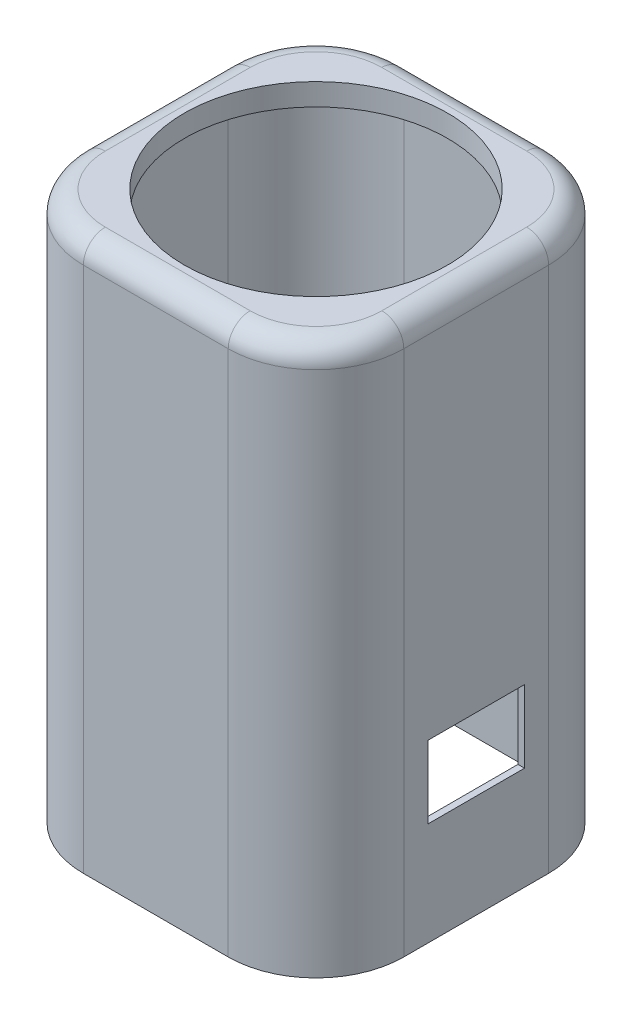
ISO-10303-21;
HEADER;
FILE_DESCRIPTION(('STEP AP214'),'2;1');
FILE_NAME('part.step','',(''),(''),'','','');
FILE_SCHEMA(('AUTOMOTIVE_DESIGN { 1 0 10303 214 1 1 1 1 }'));
ENDSEC;
DATA;
#1=APPLICATION_CONTEXT('core data for automotive mechanical design processes');
#2=APPLICATION_PROTOCOL_DEFINITION('international standard','automotive_design',2000,#1);
#3=PRODUCT_CONTEXT('',#1,'mechanical');
#4=PRODUCT('Part','Part','',(#3));
#5=PRODUCT_RELATED_PRODUCT_CATEGORY('part','',(#4));
#6=PRODUCT_DEFINITION_FORMATION('','',#4);
#7=PRODUCT_DEFINITION_CONTEXT('part definition',#1,'design');
#8=PRODUCT_DEFINITION('design','',#6,#7);
#9=PRODUCT_DEFINITION_SHAPE('','',#8);
#10=(LENGTH_UNIT() NAMED_UNIT(*) SI_UNIT(.MILLI.,.METRE.));
#11=(NAMED_UNIT(*) PLANE_ANGLE_UNIT() SI_UNIT($,.RADIAN.));
#12=(NAMED_UNIT(*) SI_UNIT($,.STERADIAN.) SOLID_ANGLE_UNIT());
#13=UNCERTAINTY_MEASURE_WITH_UNIT(LENGTH_MEASURE(1.E-05),#10,'distance_accuracy_value','');
#14=(GEOMETRIC_REPRESENTATION_CONTEXT(3) GLOBAL_UNCERTAINTY_ASSIGNED_CONTEXT((#13)) GLOBAL_UNIT_ASSIGNED_CONTEXT((#10,
#11,#12)) REPRESENTATION_CONTEXT('',''));
#15=CARTESIAN_POINT('',(0.,0.,0.));
#16=DIRECTION('',(0.,0.,1.));
#17=DIRECTION('',(1.,0.,0.));
#18=AXIS2_PLACEMENT_3D('',#15,#16,#17);
#19=CARTESIAN_POINT('',(-33.,250.,33.));
#20=DIRECTION('',(0.,1.,0.));
#21=DIRECTION('',(0.,0.,1.));
#22=AXIS2_PLACEMENT_3D('',#19,#20,#21);
#23=CYLINDRICAL_SURFACE('',#22,40.);
#24=DIRECTION('',(0.,1.,0.));
#25=VECTOR('',#24,1.);
#26=CARTESIAN_POINT('',(-33.,250.,73.));
#27=LINE('',#26,#25);
#28=CARTESIAN_POINT('',(-33.,240.,73.));
#29=VERTEX_POINT('',#28);
#30=CARTESIAN_POINT('',(-33.,0.,73.));
#31=VERTEX_POINT('',#30);
#32=EDGE_CURVE('E325',#29,#31,#27,.F.);
#33=ORIENTED_EDGE('',*,*,#32,.F.);
#34=CARTESIAN_POINT('',(-33.,240.,33.));
#35=DIRECTION('',(0.,1.,0.));
#36=DIRECTION('',(0.,0.,1.));
#37=AXIS2_PLACEMENT_3D('',#34,#35,#36);
#38=CIRCLE('',#37,40.);
#39=CARTESIAN_POINT('',(-73.,240.,33.));
#40=VERTEX_POINT('',#39);
#41=EDGE_CURVE('E44',#29,#40,#38,.F.);
#42=ORIENTED_EDGE('',*,*,#41,.T.);
#43=DIRECTION('',(0.,1.,0.));
#44=VECTOR('',#43,1.);
#45=CARTESIAN_POINT('',(-73.,250.,33.));
#46=LINE('',#45,#44);
#47=CARTESIAN_POINT('',(-73.,0.,33.));
#48=VERTEX_POINT('',#47);
#49=EDGE_CURVE('E322',#48,#40,#46,.T.);
#50=ORIENTED_EDGE('',*,*,#49,.F.);
#51=CARTESIAN_POINT('',(-33.,0.,33.));
#52=DIRECTION('',(0.,1.,0.));
#53=DIRECTION('',(0.,0.,1.));
#54=AXIS2_PLACEMENT_3D('',#51,#52,#53);
#55=CIRCLE('',#54,40.);
#56=EDGE_CURVE('E327',#31,#48,#55,.F.);
#57=ORIENTED_EDGE('',*,*,#56,.F.);
#58=EDGE_LOOP('',(#33,#42,#50,#57));
#59=FACE_BOUND('',#58,.T.);
#60=ADVANCED_FACE('F35',(#59),#23,.T.);
#61=CARTESIAN_POINT('',(-33.,250.,-33.));
#62=DIRECTION('',(0.,1.,0.));
#63=DIRECTION('',(0.,0.,1.));
#64=AXIS2_PLACEMENT_3D('',#61,#62,#63);
#65=CYLINDRICAL_SURFACE('',#64,40.);
#66=DIRECTION('',(0.,1.,0.));
#67=VECTOR('',#66,1.);
#68=CARTESIAN_POINT('',(-73.,250.,-33.));
#69=LINE('',#68,#67);
#70=CARTESIAN_POINT('',(-73.,240.,-33.));
#71=VERTEX_POINT('',#70);
#72=CARTESIAN_POINT('',(-73.,0.,-33.));
#73=VERTEX_POINT('',#72);
#74=EDGE_CURVE('E318',#71,#73,#69,.F.);
#75=ORIENTED_EDGE('',*,*,#74,.F.);
#76=CARTESIAN_POINT('',(-33.,240.,-33.));
#77=DIRECTION('',(0.,1.,0.));
#78=DIRECTION('',(0.,0.,1.));
#79=AXIS2_PLACEMENT_3D('',#76,#77,#78);
#80=CIRCLE('',#79,40.);
#81=CARTESIAN_POINT('',(-33.,240.,-73.));
#82=VERTEX_POINT('',#81);
#83=EDGE_CURVE('E346',#71,#82,#80,.F.);
#84=ORIENTED_EDGE('',*,*,#83,.T.);
#85=DIRECTION('',(0.,1.,0.));
#86=VECTOR('',#85,1.);
#87=CARTESIAN_POINT('',(-33.,250.,-73.));
#88=LINE('',#87,#86);
#89=CARTESIAN_POINT('',(-33.,0.,-73.));
#90=VERTEX_POINT('',#89);
#91=EDGE_CURVE('E315',#90,#82,#88,.T.);
#92=ORIENTED_EDGE('',*,*,#91,.F.);
#93=CARTESIAN_POINT('',(-33.,0.,-33.));
#94=DIRECTION('',(0.,1.,0.));
#95=DIRECTION('',(0.,0.,1.));
#96=AXIS2_PLACEMENT_3D('',#93,#94,#95);
#97=CIRCLE('',#96,40.);
#98=EDGE_CURVE('E320',#73,#90,#97,.F.);
#99=ORIENTED_EDGE('',*,*,#98,.F.);
#100=EDGE_LOOP('',(#75,#84,#92,#99));
#101=FACE_BOUND('',#100,.T.);
#102=ADVANCED_FACE('F407',(#101),#65,.T.);
#103=CARTESIAN_POINT('',(33.,250.,-33.));
#104=DIRECTION('',(0.,1.,0.));
#105=DIRECTION('',(0.,0.,1.));
#106=AXIS2_PLACEMENT_3D('',#103,#104,#105);
#107=CYLINDRICAL_SURFACE('',#106,40.);
#108=DIRECTION('',(0.,1.,0.));
#109=VECTOR('',#108,1.);
#110=CARTESIAN_POINT('',(33.,250.,-73.));
#111=LINE('',#110,#109);
#112=CARTESIAN_POINT('',(33.,240.,-73.));
#113=VERTEX_POINT('',#112);
#114=CARTESIAN_POINT('',(33.,0.,-73.));
#115=VERTEX_POINT('',#114);
#116=EDGE_CURVE('E311',#113,#115,#111,.F.);
#117=ORIENTED_EDGE('',*,*,#116,.F.);
#118=CARTESIAN_POINT('',(33.,240.,-33.));
#119=DIRECTION('',(0.,1.,0.));
#120=DIRECTION('',(0.,0.,1.));
#121=AXIS2_PLACEMENT_3D('',#118,#119,#120);
#122=CIRCLE('',#121,40.);
#123=CARTESIAN_POINT('',(73.,240.,-33.));
#124=VERTEX_POINT('',#123);
#125=EDGE_CURVE('E351',#113,#124,#122,.F.);
#126=ORIENTED_EDGE('',*,*,#125,.T.);
#127=DIRECTION('',(0.,1.,0.));
#128=VECTOR('',#127,1.);
#129=CARTESIAN_POINT('',(73.,250.,-33.));
#130=LINE('',#129,#128);
#131=CARTESIAN_POINT('',(73.,0.,-33.));
#132=VERTEX_POINT('',#131);
#133=EDGE_CURVE('E308',#132,#124,#130,.T.);
#134=ORIENTED_EDGE('',*,*,#133,.F.);
#135=CARTESIAN_POINT('',(33.,0.,-33.));
#136=DIRECTION('',(0.,1.,0.));
#137=DIRECTION('',(0.,0.,1.));
#138=AXIS2_PLACEMENT_3D('',#135,#136,#137);
#139=CIRCLE('',#138,40.);
#140=EDGE_CURVE('E313',#115,#132,#139,.F.);
#141=ORIENTED_EDGE('',*,*,#140,.F.);
#142=EDGE_LOOP('',(#117,#126,#134,#141));
#143=FACE_BOUND('',#142,.T.);
#144=ADVANCED_FACE('F425',(#143),#107,.T.);
#145=CARTESIAN_POINT('',(33.,250.,33.));
#146=DIRECTION('',(0.,1.,0.));
#147=DIRECTION('',(0.,0.,1.));
#148=AXIS2_PLACEMENT_3D('',#145,#146,#147);
#149=CYLINDRICAL_SURFACE('',#148,40.);
#150=DIRECTION('',(0.,1.,0.));
#151=VECTOR('',#150,1.);
#152=CARTESIAN_POINT('',(73.,250.,33.));
#153=LINE('',#152,#151);
#154=CARTESIAN_POINT('',(73.,240.,33.));
#155=VERTEX_POINT('',#154);
#156=CARTESIAN_POINT('',(73.,0.,33.));
#157=VERTEX_POINT('',#156);
#158=EDGE_CURVE('E303',#155,#157,#153,.F.);
#159=ORIENTED_EDGE('',*,*,#158,.F.);
#160=CARTESIAN_POINT('',(33.,240.,33.));
#161=DIRECTION('',(0.,1.,0.));
#162=DIRECTION('',(0.,0.,1.));
#163=AXIS2_PLACEMENT_3D('',#160,#161,#162);
#164=CIRCLE('',#163,40.);
#165=CARTESIAN_POINT('',(33.,240.,73.));
#166=VERTEX_POINT('',#165);
#167=EDGE_CURVE('E355',#155,#166,#164,.F.);
#168=ORIENTED_EDGE('',*,*,#167,.T.);
#169=DIRECTION('',(0.,1.,0.));
#170=VECTOR('',#169,1.);
#171=CARTESIAN_POINT('',(33.,250.,73.));
#172=LINE('',#171,#170);
#173=CARTESIAN_POINT('',(33.,0.,73.));
#174=VERTEX_POINT('',#173);
#175=EDGE_CURVE('E300',#174,#166,#172,.T.);
#176=ORIENTED_EDGE('',*,*,#175,.F.);
#177=CARTESIAN_POINT('',(33.,0.,33.));
#178=DIRECTION('',(0.,1.,0.));
#179=DIRECTION('',(0.,0.,1.));
#180=AXIS2_PLACEMENT_3D('',#177,#178,#179);
#181=CIRCLE('',#180,40.);
#182=EDGE_CURVE('E305',#157,#174,#181,.F.);
#183=ORIENTED_EDGE('',*,*,#182,.F.);
#184=EDGE_LOOP('',(#159,#168,#176,#183));
#185=FACE_BOUND('',#184,.T.);
#186=ADVANCED_FACE('F439',(#185),#149,.T.);
#187=CARTESIAN_POINT('',(-73.,250.,-73.));
#188=DIRECTION('',(1.,0.,0.));
#189=DIRECTION('',(0.,0.,-1.));
#190=AXIS2_PLACEMENT_3D('',#187,#188,#189);
#191=PLANE('',#190);
#192=DIRECTION('',(0.,0.,1.));
#193=VECTOR('',#192,1.);
#194=CARTESIAN_POINT('',(-73.,0.,-73.));
#195=LINE('',#194,#193);
#196=CARTESIAN_POINT('',(-73.,0.,-16.));
#197=VERTEX_POINT('',#196);
#198=EDGE_CURVE('E289',#73,#197,#195,.T.);
#199=ORIENTED_EDGE('',*,*,#198,.T.);
#200=DIRECTION('',(0.,-1.,0.));
#201=VECTOR('',#200,1.);
#202=CARTESIAN_POINT('',(-73.,0.,-16.));
#203=LINE('',#202,#201);
#204=CARTESIAN_POINT('',(-73.,13.,-16.));
#205=VERTEX_POINT('',#204);
#206=EDGE_CURVE('E229',#205,#197,#203,.T.);
#207=ORIENTED_EDGE('',*,*,#206,.F.);
#208=DIRECTION('',(0.,0.,-1.));
#209=VECTOR('',#208,1.);
#210=CARTESIAN_POINT('',(-73.,13.,-16.));
#211=LINE('',#210,#209);
#212=CARTESIAN_POINT('',(-73.,13.,16.));
#213=VERTEX_POINT('',#212);
#214=EDGE_CURVE('E455',#213,#205,#211,.T.);
#215=ORIENTED_EDGE('',*,*,#214,.F.);
#216=DIRECTION('',(0.,1.,0.));
#217=VECTOR('',#216,1.);
#218=CARTESIAN_POINT('',(-73.,13.,16.));
#219=LINE('',#218,#217);
#220=CARTESIAN_POINT('',(-73.,0.,16.));
#221=VERTEX_POINT('',#220);
#222=EDGE_CURVE('E388',#221,#213,#219,.T.);
#223=ORIENTED_EDGE('',*,*,#222,.F.);
#224=EDGE_CURVE('E239',#221,#48,#195,.T.);
#225=ORIENTED_EDGE('',*,*,#224,.T.);
#226=ORIENTED_EDGE('',*,*,#49,.T.);
#227=DIRECTION('',(0.,0.,1.));
#228=VECTOR('',#227,1.);
#229=CARTESIAN_POINT('',(-73.,240.,-33.));
#230=LINE('',#229,#228);
#231=EDGE_CURVE('E11',#40,#71,#230,.F.);
#232=ORIENTED_EDGE('',*,*,#231,.T.);
#233=ORIENTED_EDGE('',*,*,#74,.T.);
#234=EDGE_LOOP('',(#199,#207,#215,#223,#225,#226,#232,#233));
#235=FACE_BOUND('',#234,.T.);
#236=ADVANCED_FACE('F384',(#235),#191,.F.);
#237=CARTESIAN_POINT('',(-73.,250.,73.));
#238=DIRECTION('',(0.,0.,-1.));
#239=DIRECTION('',(-1.,0.,0.));
#240=AXIS2_PLACEMENT_3D('',#237,#238,#239);
#241=PLANE('',#240);
#242=ORIENTED_EDGE('',*,*,#175,.T.);
#243=DIRECTION('',(1.,0.,0.));
#244=VECTOR('',#243,1.);
#245=CARTESIAN_POINT('',(-33.,240.,73.));
#246=LINE('',#245,#244);
#247=EDGE_CURVE('E357',#166,#29,#246,.F.);
#248=ORIENTED_EDGE('',*,*,#247,.T.);
#249=ORIENTED_EDGE('',*,*,#32,.T.);
#250=DIRECTION('',(1.,0.,0.));
#251=VECTOR('',#250,1.);
#252=CARTESIAN_POINT('',(-73.,0.,73.));
#253=LINE('',#252,#251);
#254=EDGE_CURVE('E292',#31,#174,#253,.T.);
#255=ORIENTED_EDGE('',*,*,#254,.T.);
#256=EDGE_LOOP('',(#242,#248,#249,#255));
#257=FACE_BOUND('',#256,.T.);
#258=ADVANCED_FACE('F450',(#257),#241,.F.);
#259=CARTESIAN_POINT('',(73.,250.,-73.));
#260=DIRECTION('',(-1.,0.,0.));
#261=DIRECTION('',(0.,0.,1.));
#262=AXIS2_PLACEMENT_3D('',#259,#260,#261);
#263=PLANE('',#262);
#264=DIRECTION('',(0.,0.,-1.));
#265=VECTOR('',#264,1.);
#266=CARTESIAN_POINT('',(73.,47.,22.));
#267=LINE('',#266,#265);
#268=CARTESIAN_POINT('',(73.,47.,22.));
#269=VERTEX_POINT('',#268);
#270=CARTESIAN_POINT('',(73.,47.,-22.));
#271=VERTEX_POINT('',#270);
#272=EDGE_CURVE('E479',#269,#271,#267,.T.);
#273=ORIENTED_EDGE('',*,*,#272,.F.);
#274=DIRECTION('',(0.,-1.,0.));
#275=VECTOR('',#274,1.);
#276=CARTESIAN_POINT('',(73.,80.,22.));
#277=LINE('',#276,#275);
#278=CARTESIAN_POINT('',(73.,80.,22.));
#279=VERTEX_POINT('',#278);
#280=EDGE_CURVE('E60',#279,#269,#277,.T.);
#281=ORIENTED_EDGE('',*,*,#280,.F.);
#282=DIRECTION('',(0.,0.,-1.));
#283=VECTOR('',#282,1.);
#284=CARTESIAN_POINT('',(73.,80.,22.));
#285=LINE('',#284,#283);
#286=CARTESIAN_POINT('',(73.,80.,-22.));
#287=VERTEX_POINT('',#286);
#288=EDGE_CURVE('E469',#279,#287,#285,.T.);
#289=ORIENTED_EDGE('',*,*,#288,.T.);
#290=DIRECTION('',(0.,-1.,0.));
#291=VECTOR('',#290,1.);
#292=CARTESIAN_POINT('',(73.,80.,-22.));
#293=LINE('',#292,#291);
#294=EDGE_CURVE('E482',#287,#271,#293,.T.);
#295=ORIENTED_EDGE('',*,*,#294,.T.);
#296=EDGE_LOOP('',(#273,#281,#289,#295));
#297=FACE_BOUND('',#296,.T.);
#298=ORIENTED_EDGE('',*,*,#133,.T.);
#299=DIRECTION('',(0.,0.,-1.));
#300=VECTOR('',#299,1.);
#301=CARTESIAN_POINT('',(73.,240.,33.));
#302=LINE('',#301,#300);
#303=EDGE_CURVE('E353',#124,#155,#302,.F.);
#304=ORIENTED_EDGE('',*,*,#303,.T.);
#305=ORIENTED_EDGE('',*,*,#158,.T.);
#306=DIRECTION('',(0.,0.,-1.));
#307=VECTOR('',#306,1.);
#308=CARTESIAN_POINT('',(73.,0.,-73.));
#309=LINE('',#308,#307);
#310=EDGE_CURVE('E294',#157,#132,#309,.T.);
#311=ORIENTED_EDGE('',*,*,#310,.T.);
#312=EDGE_LOOP('',(#298,#304,#305,#311));
#313=FACE_BOUND('',#312,.T.);
#314=ADVANCED_FACE('F435',(#297,#313),#263,.F.);
#315=CARTESIAN_POINT('',(-73.,250.,-73.));
#316=DIRECTION('',(0.,0.,1.));
#317=DIRECTION('',(1.,0.,0.));
#318=AXIS2_PLACEMENT_3D('',#315,#316,#317);
#319=PLANE('',#318);
#320=ORIENTED_EDGE('',*,*,#91,.T.);
#321=DIRECTION('',(-1.,0.,0.));
#322=VECTOR('',#321,1.);
#323=CARTESIAN_POINT('',(33.,240.,-73.));
#324=LINE('',#323,#322);
#325=EDGE_CURVE('E349',#82,#113,#324,.F.);
#326=ORIENTED_EDGE('',*,*,#325,.T.);
#327=ORIENTED_EDGE('',*,*,#116,.T.);
#328=DIRECTION('',(-1.,0.,0.));
#329=VECTOR('',#328,1.);
#330=CARTESIAN_POINT('',(-73.,0.,-73.));
#331=LINE('',#330,#329);
#332=EDGE_CURVE('E297',#115,#90,#331,.T.);
#333=ORIENTED_EDGE('',*,*,#332,.T.);
#334=EDGE_LOOP('',(#320,#326,#327,#333));
#335=FACE_BOUND('',#334,.T.);
#336=ADVANCED_FACE('F421',(#335),#319,.F.);
#337=CARTESIAN_POINT('',(0.,250.,0.));
#338=DIRECTION('',(0.,1.,0.));
#339=DIRECTION('',(0.,0.,1.));
#340=AXIS2_PLACEMENT_3D('',#337,#338,#339);
#341=PLANE('',#340);
#342=CARTESIAN_POINT('',(0.,250.,0.));
#343=DIRECTION('',(0.,1.,0.));
#344=DIRECTION('',(0.,0.,1.));
#345=AXIS2_PLACEMENT_3D('',#342,#343,#344);
#346=CIRCLE('',#345,60.);
#347=CARTESIAN_POINT('',(0.,250.,60.));
#348=VERTEX_POINT('',#347);
#349=EDGE_CURVE('E489',#348,#348,#346,.T.);
#350=ORIENTED_EDGE('',*,*,#349,.F.);
#351=EDGE_LOOP('',(#350));
#352=FACE_BOUND('',#351,.T.);
#353=DIRECTION('',(-1.,0.,0.));
#354=VECTOR('',#353,1.);
#355=CARTESIAN_POINT('',(-33.,250.,-63.));
#356=LINE('',#355,#354);
#357=CARTESIAN_POINT('',(33.,250.,-63.));
#358=VERTEX_POINT('',#357);
#359=CARTESIAN_POINT('',(-33.,250.,-63.));
#360=VERTEX_POINT('',#359);
#361=EDGE_CURVE('E341',#358,#360,#356,.T.);
#362=ORIENTED_EDGE('',*,*,#361,.T.);
#363=CARTESIAN_POINT('',(-33.,250.,-33.));
#364=DIRECTION('',(0.,1.,0.));
#365=DIRECTION('',(0.,0.,1.));
#366=AXIS2_PLACEMENT_3D('',#363,#364,#365);
#367=CIRCLE('',#366,30.);
#368=CARTESIAN_POINT('',(-63.,250.,-33.));
#369=VERTEX_POINT('',#368);
#370=EDGE_CURVE('E343',#360,#369,#367,.T.);
#371=ORIENTED_EDGE('',*,*,#370,.T.);
#372=DIRECTION('',(0.,0.,1.));
#373=VECTOR('',#372,1.);
#374=CARTESIAN_POINT('',(-63.,250.,33.));
#375=LINE('',#374,#373);
#376=CARTESIAN_POINT('',(-63.,250.,33.));
#377=VERTEX_POINT('',#376);
#378=EDGE_CURVE('E329',#369,#377,#375,.T.);
#379=ORIENTED_EDGE('',*,*,#378,.T.);
#380=CARTESIAN_POINT('',(-33.,250.,33.));
#381=DIRECTION('',(0.,1.,0.));
#382=DIRECTION('',(0.,0.,1.));
#383=AXIS2_PLACEMENT_3D('',#380,#381,#382);
#384=CIRCLE('',#383,30.);
#385=CARTESIAN_POINT('',(-33.,250.,63.));
#386=VERTEX_POINT('',#385);
#387=EDGE_CURVE('E331',#377,#386,#384,.T.);
#388=ORIENTED_EDGE('',*,*,#387,.T.);
#389=DIRECTION('',(1.,0.,0.));
#390=VECTOR('',#389,1.);
#391=CARTESIAN_POINT('',(33.,250.,63.));
#392=LINE('',#391,#390);
#393=CARTESIAN_POINT('',(33.,250.,63.));
#394=VERTEX_POINT('',#393);
#395=EDGE_CURVE('E333',#386,#394,#392,.T.);
#396=ORIENTED_EDGE('',*,*,#395,.T.);
#397=CARTESIAN_POINT('',(33.,250.,33.));
#398=DIRECTION('',(0.,1.,0.));
#399=DIRECTION('',(0.,0.,1.));
#400=AXIS2_PLACEMENT_3D('',#397,#398,#399);
#401=CIRCLE('',#400,30.);
#402=CARTESIAN_POINT('',(63.,250.,33.));
#403=VERTEX_POINT('',#402);
#404=EDGE_CURVE('E335',#394,#403,#401,.T.);
#405=ORIENTED_EDGE('',*,*,#404,.T.);
#406=DIRECTION('',(0.,0.,-1.));
#407=VECTOR('',#406,1.);
#408=CARTESIAN_POINT('',(63.,250.,-33.));
#409=LINE('',#408,#407);
#410=CARTESIAN_POINT('',(63.,250.,-33.));
#411=VERTEX_POINT('',#410);
#412=EDGE_CURVE('E337',#403,#411,#409,.T.);
#413=ORIENTED_EDGE('',*,*,#412,.T.);
#414=CARTESIAN_POINT('',(33.,250.,-33.));
#415=DIRECTION('',(0.,1.,0.));
#416=DIRECTION('',(0.,0.,1.));
#417=AXIS2_PLACEMENT_3D('',#414,#415,#416);
#418=CIRCLE('',#417,30.);
#419=EDGE_CURVE('E339',#411,#358,#418,.T.);
#420=ORIENTED_EDGE('',*,*,#419,.T.);
#421=EDGE_LOOP('',(#362,#371,#379,#388,#396,#405,#413,#420));
#422=FACE_BOUND('',#421,.T.);
#423=ADVANCED_FACE('F590',(#352,#422),#341,.T.);
#424=CARTESIAN_POINT('',(0.,0.,0.));
#425=DIRECTION('',(0.,1.,0.));
#426=DIRECTION('',(0.,0.,1.));
#427=AXIS2_PLACEMENT_3D('',#424,#425,#426);
#428=PLANE('',#427);
#429=DIRECTION('',(0.,0.,-1.));
#430=VECTOR('',#429,1.);
#431=CARTESIAN_POINT('',(-70.,0.,29.9999999999997));
#432=LINE('',#431,#430);
#433=CARTESIAN_POINT('',(-70.,0.,-16.));
#434=VERTEX_POINT('',#433);
#435=CARTESIAN_POINT('',(-70.,0.,-29.9999999999997));
#436=VERTEX_POINT('',#435);
#437=EDGE_CURVE('E247',#434,#436,#432,.T.);
#438=ORIENTED_EDGE('',*,*,#437,.F.);
#439=DIRECTION('',(-1.,0.,0.));
#440=VECTOR('',#439,1.);
#441=CARTESIAN_POINT('',(-70.,0.,-16.));
#442=LINE('',#441,#440);
#443=EDGE_CURVE('E452',#434,#197,#442,.T.);
#444=ORIENTED_EDGE('',*,*,#443,.T.);
#445=ORIENTED_EDGE('',*,*,#198,.F.);
#446=ORIENTED_EDGE('',*,*,#98,.T.);
#447=ORIENTED_EDGE('',*,*,#332,.F.);
#448=ORIENTED_EDGE('',*,*,#140,.T.);
#449=ORIENTED_EDGE('',*,*,#310,.F.);
#450=ORIENTED_EDGE('',*,*,#182,.T.);
#451=ORIENTED_EDGE('',*,*,#254,.F.);
#452=ORIENTED_EDGE('',*,*,#56,.T.);
#453=ORIENTED_EDGE('',*,*,#224,.F.);
#454=DIRECTION('',(-1.,0.,0.));
#455=VECTOR('',#454,1.);
#456=CARTESIAN_POINT('',(-70.,0.,16.));
#457=LINE('',#456,#455);
#458=CARTESIAN_POINT('',(-70.,0.,16.));
#459=VERTEX_POINT('',#458);
#460=EDGE_CURVE('E224',#459,#221,#457,.T.);
#461=ORIENTED_EDGE('',*,*,#460,.F.);
#462=CARTESIAN_POINT('',(-70.,0.,29.9999999999997));
#463=VERTEX_POINT('',#462);
#464=EDGE_CURVE('E237',#463,#459,#432,.T.);
#465=ORIENTED_EDGE('',*,*,#464,.F.);
#466=CARTESIAN_POINT('',(-30.,0.,30.));
#467=DIRECTION('',(0.,-1.,0.));
#468=DIRECTION('',(0.,0.,-1.));
#469=AXIS2_PLACEMENT_3D('',#466,#467,#468);
#470=CIRCLE('',#469,40.);
#471=CARTESIAN_POINT('',(-29.9999999999997,0.,70.));
#472=VERTEX_POINT('',#471);
#473=EDGE_CURVE('E252',#472,#463,#470,.T.);
#474=ORIENTED_EDGE('',*,*,#473,.F.);
#475=DIRECTION('',(-1.,0.,0.));
#476=VECTOR('',#475,1.);
#477=CARTESIAN_POINT('',(-29.9999999999997,0.,70.));
#478=LINE('',#477,#476);
#479=CARTESIAN_POINT('',(29.9999999999997,0.,70.));
#480=VERTEX_POINT('',#479);
#481=EDGE_CURVE('E267',#480,#472,#478,.T.);
#482=ORIENTED_EDGE('',*,*,#481,.F.);
#483=CARTESIAN_POINT('',(30.,0.,30.));
#484=DIRECTION('',(0.,-1.,0.));
#485=DIRECTION('',(0.,0.,-1.));
#486=AXIS2_PLACEMENT_3D('',#483,#484,#485);
#487=CIRCLE('',#486,40.);
#488=CARTESIAN_POINT('',(70.,0.,29.9999999999997));
#489=VERTEX_POINT('',#488);
#490=EDGE_CURVE('E264',#489,#480,#487,.T.);
#491=ORIENTED_EDGE('',*,*,#490,.F.);
#492=DIRECTION('',(0.,0.,1.));
#493=VECTOR('',#492,1.);
#494=CARTESIAN_POINT('',(70.,0.,29.9999999999997));
#495=LINE('',#494,#493);
#496=CARTESIAN_POINT('',(70.,0.,-29.9999999999997));
#497=VERTEX_POINT('',#496);
#498=EDGE_CURVE('E261',#497,#489,#495,.T.);
#499=ORIENTED_EDGE('',*,*,#498,.F.);
#500=CARTESIAN_POINT('',(30.,0.,-30.));
#501=DIRECTION('',(0.,-1.,0.));
#502=DIRECTION('',(0.,0.,1.));
#503=AXIS2_PLACEMENT_3D('',#500,#501,#502);
#504=CIRCLE('',#503,40.);
#505=CARTESIAN_POINT('',(29.9999999999997,0.,-70.));
#506=VERTEX_POINT('',#505);
#507=EDGE_CURVE('E258',#506,#497,#504,.T.);
#508=ORIENTED_EDGE('',*,*,#507,.F.);
#509=DIRECTION('',(1.,0.,0.));
#510=VECTOR('',#509,1.);
#511=CARTESIAN_POINT('',(-29.9999999999997,0.,-70.));
#512=LINE('',#511,#510);
#513=CARTESIAN_POINT('',(-29.9999999999997,0.,-70.));
#514=VERTEX_POINT('',#513);
#515=EDGE_CURVE('E250',#514,#506,#512,.T.);
#516=ORIENTED_EDGE('',*,*,#515,.F.);
#517=CARTESIAN_POINT('',(-30.,0.,-30.));
#518=DIRECTION('',(0.,-1.,0.));
#519=DIRECTION('',(0.,0.,1.));
#520=AXIS2_PLACEMENT_3D('',#517,#518,#519);
#521=CIRCLE('',#520,40.);
#522=EDGE_CURVE('E246',#436,#514,#521,.T.);
#523=ORIENTED_EDGE('',*,*,#522,.F.);
#524=EDGE_LOOP('',(#438,#444,#445,#446,#447,#448,#449,#450,#451,#452,#453,#461,#465,#474,#482,
#491,#499,#508,#516,#523));
#525=FACE_BOUND('',#524,.T.);
#526=ADVANCED_FACE('F235',(#525),#428,.F.);
#527=CARTESIAN_POINT('',(33.,240.,33.));
#528=DIRECTION('',(0.,1.,0.));
#529=DIRECTION('',(0.,0.,1.));
#530=AXIS2_PLACEMENT_3D('',#527,#528,#529);
#531=TOROIDAL_SURFACE('',#530,30.,10.);
#532=CARTESIAN_POINT('',(33.,240.,63.));
#533=DIRECTION('',(-1.,0.,0.));
#534=DIRECTION('',(0.,0.,1.));
#535=AXIS2_PLACEMENT_3D('',#532,#533,#534);
#536=CIRCLE('',#535,10.);
#537=EDGE_CURVE('E375',#166,#394,#536,.T.);
#538=ORIENTED_EDGE('',*,*,#537,.F.);
#539=ORIENTED_EDGE('',*,*,#167,.F.);
#540=CARTESIAN_POINT('',(63.,240.,33.));
#541=DIRECTION('',(0.,0.,-1.));
#542=DIRECTION('',(-1.,0.,0.));
#543=AXIS2_PLACEMENT_3D('',#540,#541,#542);
#544=CIRCLE('',#543,10.);
#545=EDGE_CURVE('E377',#403,#155,#544,.T.);
#546=ORIENTED_EDGE('',*,*,#545,.F.);
#547=ORIENTED_EDGE('',*,*,#404,.F.);
#548=EDGE_LOOP('',(#538,#539,#546,#547));
#549=FACE_BOUND('',#548,.T.);
#550=ADVANCED_FACE('F37',(#549),#531,.T.);
#551=CARTESIAN_POINT('',(63.,240.,0.));
#552=DIRECTION('',(0.,0.,1.));
#553=DIRECTION('',(1.,0.,0.));
#554=AXIS2_PLACEMENT_3D('',#551,#552,#553);
#555=CYLINDRICAL_SURFACE('',#554,10.);
#556=ORIENTED_EDGE('',*,*,#545,.T.);
#557=ORIENTED_EDGE('',*,*,#303,.F.);
#558=CARTESIAN_POINT('',(63.,240.,-33.));
#559=DIRECTION('',(0.,0.,-1.));
#560=DIRECTION('',(-1.,0.,0.));
#561=AXIS2_PLACEMENT_3D('',#558,#559,#560);
#562=CIRCLE('',#561,10.);
#563=EDGE_CURVE('E372',#411,#124,#562,.T.);
#564=ORIENTED_EDGE('',*,*,#563,.F.);
#565=ORIENTED_EDGE('',*,*,#412,.F.);
#566=EDGE_LOOP('',(#556,#557,#564,#565));
#567=FACE_BOUND('',#566,.T.);
#568=ADVANCED_FACE('F432',(#567),#555,.T.);
#569=CARTESIAN_POINT('',(0.,240.,63.));
#570=DIRECTION('',(-1.,0.,0.));
#571=DIRECTION('',(0.,0.,1.));
#572=AXIS2_PLACEMENT_3D('',#569,#570,#571);
#573=CYLINDRICAL_SURFACE('',#572,10.);
#574=ORIENTED_EDGE('',*,*,#537,.T.);
#575=ORIENTED_EDGE('',*,*,#395,.F.);
#576=CARTESIAN_POINT('',(-33.,240.,63.));
#577=DIRECTION('',(-1.,0.,0.));
#578=DIRECTION('',(0.,0.,1.));
#579=AXIS2_PLACEMENT_3D('',#576,#577,#578);
#580=CIRCLE('',#579,10.);
#581=EDGE_CURVE('E369',#29,#386,#580,.T.);
#582=ORIENTED_EDGE('',*,*,#581,.F.);
#583=ORIENTED_EDGE('',*,*,#247,.F.);
#584=EDGE_LOOP('',(#574,#575,#582,#583));
#585=FACE_BOUND('',#584,.T.);
#586=ADVANCED_FACE('F448',(#585),#573,.T.);
#587=CARTESIAN_POINT('',(33.,240.,-33.));
#588=DIRECTION('',(0.,1.,0.));
#589=DIRECTION('',(0.,0.,1.));
#590=AXIS2_PLACEMENT_3D('',#587,#588,#589);
#591=TOROIDAL_SURFACE('',#590,30.,10.);
#592=ORIENTED_EDGE('',*,*,#563,.T.);
#593=ORIENTED_EDGE('',*,*,#125,.F.);
#594=CARTESIAN_POINT('',(33.,240.,-63.));
#595=DIRECTION('',(-1.,0.,0.));
#596=DIRECTION('',(0.,0.,1.));
#597=AXIS2_PLACEMENT_3D('',#594,#595,#596);
#598=CIRCLE('',#597,10.);
#599=EDGE_CURVE('E366',#358,#113,#598,.T.);
#600=ORIENTED_EDGE('',*,*,#599,.F.);
#601=ORIENTED_EDGE('',*,*,#419,.F.);
#602=EDGE_LOOP('',(#592,#593,#600,#601));
#603=FACE_BOUND('',#602,.T.);
#604=ADVANCED_FACE('F429',(#603),#591,.T.);
#605=CARTESIAN_POINT('',(-33.,240.,33.));
#606=DIRECTION('',(0.,1.,0.));
#607=DIRECTION('',(0.,0.,1.));
#608=AXIS2_PLACEMENT_3D('',#605,#606,#607);
#609=TOROIDAL_SURFACE('',#608,30.,10.);
#610=ORIENTED_EDGE('',*,*,#581,.T.);
#611=ORIENTED_EDGE('',*,*,#387,.F.);
#612=CARTESIAN_POINT('',(-63.,240.,33.));
#613=DIRECTION('',(0.,0.,-1.));
#614=DIRECTION('',(-1.,0.,0.));
#615=AXIS2_PLACEMENT_3D('',#612,#613,#614);
#616=CIRCLE('',#615,10.);
#617=EDGE_CURVE('E363',#40,#377,#616,.T.);
#618=ORIENTED_EDGE('',*,*,#617,.F.);
#619=ORIENTED_EDGE('',*,*,#41,.F.);
#620=EDGE_LOOP('',(#610,#611,#618,#619));
#621=FACE_BOUND('',#620,.T.);
#622=ADVANCED_FACE('F396',(#621),#609,.T.);
#623=CARTESIAN_POINT('',(0.,240.,-63.));
#624=DIRECTION('',(1.,0.,0.));
#625=DIRECTION('',(0.,0.,-1.));
#626=AXIS2_PLACEMENT_3D('',#623,#624,#625);
#627=CYLINDRICAL_SURFACE('',#626,10.);
#628=ORIENTED_EDGE('',*,*,#599,.T.);
#629=ORIENTED_EDGE('',*,*,#325,.F.);
#630=CARTESIAN_POINT('',(-33.,240.,-63.));
#631=DIRECTION('',(-1.,0.,0.));
#632=DIRECTION('',(0.,0.,1.));
#633=AXIS2_PLACEMENT_3D('',#630,#631,#632);
#634=CIRCLE('',#633,10.);
#635=EDGE_CURVE('E361',#360,#82,#634,.T.);
#636=ORIENTED_EDGE('',*,*,#635,.F.);
#637=ORIENTED_EDGE('',*,*,#361,.F.);
#638=EDGE_LOOP('',(#628,#629,#636,#637));
#639=FACE_BOUND('',#638,.T.);
#640=ADVANCED_FACE('F417',(#639),#627,.T.);
#641=CARTESIAN_POINT('',(-63.,240.,0.));
#642=DIRECTION('',(0.,0.,-1.));
#643=DIRECTION('',(-1.,0.,0.));
#644=AXIS2_PLACEMENT_3D('',#641,#642,#643);
#645=CYLINDRICAL_SURFACE('',#644,10.);
#646=ORIENTED_EDGE('',*,*,#617,.T.);
#647=ORIENTED_EDGE('',*,*,#378,.F.);
#648=CARTESIAN_POINT('',(-63.,240.,-33.));
#649=DIRECTION('',(0.,0.,-1.));
#650=DIRECTION('',(-1.,0.,0.));
#651=AXIS2_PLACEMENT_3D('',#648,#649,#650);
#652=CIRCLE('',#651,10.);
#653=EDGE_CURVE('E273',#71,#369,#652,.T.);
#654=ORIENTED_EDGE('',*,*,#653,.F.);
#655=ORIENTED_EDGE('',*,*,#231,.F.);
#656=EDGE_LOOP('',(#646,#647,#654,#655));
#657=FACE_BOUND('',#656,.T.);
#658=ADVANCED_FACE('F402',(#657),#645,.T.);
#659=CARTESIAN_POINT('',(-33.,240.,-33.));
#660=DIRECTION('',(0.,1.,0.));
#661=DIRECTION('',(0.,0.,1.));
#662=AXIS2_PLACEMENT_3D('',#659,#660,#661);
#663=TOROIDAL_SURFACE('',#662,30.,10.);
#664=ORIENTED_EDGE('',*,*,#635,.T.);
#665=ORIENTED_EDGE('',*,*,#83,.F.);
#666=ORIENTED_EDGE('',*,*,#653,.T.);
#667=ORIENTED_EDGE('',*,*,#370,.F.);
#668=EDGE_LOOP('',(#664,#665,#666,#667));
#669=FACE_BOUND('',#668,.T.);
#670=ADVANCED_FACE('F411',(#669),#663,.T.);
#671=CARTESIAN_POINT('',(-30.,240.,30.));
#672=DIRECTION('',(0.,-1.,0.));
#673=DIRECTION('',(0.,0.,-1.));
#674=AXIS2_PLACEMENT_3D('',#671,#672,#673);
#675=CYLINDRICAL_SURFACE('',#674,40.);
#676=ORIENTED_EDGE('',*,*,#473,.T.);
#677=DIRECTION('',(0.,-1.,0.));
#678=VECTOR('',#677,1.);
#679=CARTESIAN_POINT('',(-70.,240.,29.9999999999997));
#680=LINE('',#679,#678);
#681=CARTESIAN_POINT('',(-70.,240.,29.9999999999997));
#682=VERTEX_POINT('',#681);
#683=EDGE_CURVE('E245',#682,#463,#680,.T.);
#684=ORIENTED_EDGE('',*,*,#683,.F.);
#685=CARTESIAN_POINT('',(-30.,240.,30.));
#686=DIRECTION('',(0.,-1.,0.));
#687=DIRECTION('',(0.,0.,-1.));
#688=AXIS2_PLACEMENT_3D('',#685,#686,#687);
#689=CIRCLE('',#688,40.);
#690=CARTESIAN_POINT('',(-29.9999999999997,240.,70.));
#691=VERTEX_POINT('',#690);
#692=EDGE_CURVE('E270',#691,#682,#689,.T.);
#693=ORIENTED_EDGE('',*,*,#692,.F.);
#694=DIRECTION('',(0.,-1.,0.));
#695=VECTOR('',#694,1.);
#696=CARTESIAN_POINT('',(-29.9999999999997,240.,70.));
#697=LINE('',#696,#695);
#698=EDGE_CURVE('E271',#691,#472,#697,.T.);
#699=ORIENTED_EDGE('',*,*,#698,.T.);
#700=EDGE_LOOP('',(#676,#684,#693,#699));
#701=FACE_BOUND('',#700,.T.);
#702=ADVANCED_FACE('F526',(#701),#675,.F.);
#703=CARTESIAN_POINT('',(-29.9999999999997,240.,70.));
#704=DIRECTION('',(0.,0.,1.));
#705=DIRECTION('',(1.,0.,0.));
#706=AXIS2_PLACEMENT_3D('',#703,#704,#705);
#707=PLANE('',#706);
#708=ORIENTED_EDGE('',*,*,#481,.T.);
#709=ORIENTED_EDGE('',*,*,#698,.F.);
#710=DIRECTION('',(-1.,0.,0.));
#711=VECTOR('',#710,1.);
#712=CARTESIAN_POINT('',(-29.9999999999997,240.,70.));
#713=LINE('',#712,#711);
#714=CARTESIAN_POINT('',(29.9999999999997,240.,70.));
#715=VERTEX_POINT('',#714);
#716=EDGE_CURVE('E288',#715,#691,#713,.T.);
#717=ORIENTED_EDGE('',*,*,#716,.F.);
#718=DIRECTION('',(0.,-1.,0.));
#719=VECTOR('',#718,1.);
#720=CARTESIAN_POINT('',(29.9999999999997,240.,70.));
#721=LINE('',#720,#719);
#722=EDGE_CURVE('E274',#715,#480,#721,.T.);
#723=ORIENTED_EDGE('',*,*,#722,.T.);
#724=EDGE_LOOP('',(#708,#709,#717,#723));
#725=FACE_BOUND('',#724,.T.);
#726=ADVANCED_FACE('F523',(#725),#707,.F.);
#727=CARTESIAN_POINT('',(30.,240.,30.));
#728=DIRECTION('',(0.,-1.,0.));
#729=DIRECTION('',(0.,0.,-1.));
#730=AXIS2_PLACEMENT_3D('',#727,#728,#729);
#731=CYLINDRICAL_SURFACE('',#730,40.);
#732=ORIENTED_EDGE('',*,*,#490,.T.);
#733=ORIENTED_EDGE('',*,*,#722,.F.);
#734=CARTESIAN_POINT('',(30.,240.,30.));
#735=DIRECTION('',(0.,-1.,0.));
#736=DIRECTION('',(0.,0.,-1.));
#737=AXIS2_PLACEMENT_3D('',#734,#735,#736);
#738=CIRCLE('',#737,40.);
#739=CARTESIAN_POINT('',(70.,240.,29.9999999999997));
#740=VERTEX_POINT('',#739);
#741=EDGE_CURVE('E514',#740,#715,#738,.T.);
#742=ORIENTED_EDGE('',*,*,#741,.F.);
#743=DIRECTION('',(0.,-1.,0.));
#744=VECTOR('',#743,1.);
#745=CARTESIAN_POINT('',(70.,240.,29.9999999999997));
#746=LINE('',#745,#744);
#747=EDGE_CURVE('E276',#740,#489,#746,.T.);
#748=ORIENTED_EDGE('',*,*,#747,.T.);
#749=EDGE_LOOP('',(#732,#733,#742,#748));
#750=FACE_BOUND('',#749,.T.);
#751=ADVANCED_FACE('F545',(#750),#731,.F.);
#752=CARTESIAN_POINT('',(70.,240.,29.9999999999997));
#753=DIRECTION('',(1.,0.,0.));
#754=DIRECTION('',(0.,0.,-1.));
#755=AXIS2_PLACEMENT_3D('',#752,#753,#754);
#756=PLANE('',#755);
#757=DIRECTION('',(0.,0.,-1.));
#758=VECTOR('',#757,1.);
#759=CARTESIAN_POINT('',(70.,80.,22.));
#760=LINE('',#759,#758);
#761=CARTESIAN_POINT('',(70.,80.,22.));
#762=VERTEX_POINT('',#761);
#763=CARTESIAN_POINT('',(70.,80.,-22.));
#764=VERTEX_POINT('',#763);
#765=EDGE_CURVE('E475',#762,#764,#760,.T.);
#766=ORIENTED_EDGE('',*,*,#765,.F.);
#767=DIRECTION('',(0.,-1.,0.));
#768=VECTOR('',#767,1.);
#769=CARTESIAN_POINT('',(70.,80.,22.));
#770=LINE('',#769,#768);
#771=CARTESIAN_POINT('',(70.,47.,22.));
#772=VERTEX_POINT('',#771);
#773=EDGE_CURVE('E465',#762,#772,#770,.T.);
#774=ORIENTED_EDGE('',*,*,#773,.T.);
#775=DIRECTION('',(0.,0.,-1.));
#776=VECTOR('',#775,1.);
#777=CARTESIAN_POINT('',(70.,47.,22.));
#778=LINE('',#777,#776);
#779=CARTESIAN_POINT('',(70.,47.,-22.));
#780=VERTEX_POINT('',#779);
#781=EDGE_CURVE('E468',#772,#780,#778,.T.);
#782=ORIENTED_EDGE('',*,*,#781,.T.);
#783=DIRECTION('',(0.,-1.,0.));
#784=VECTOR('',#783,1.);
#785=CARTESIAN_POINT('',(70.,80.,-22.));
#786=LINE('',#785,#784);
#787=EDGE_CURVE('E472',#764,#780,#786,.T.);
#788=ORIENTED_EDGE('',*,*,#787,.F.);
#789=EDGE_LOOP('',(#766,#774,#782,#788));
#790=FACE_BOUND('',#789,.T.);
#791=ORIENTED_EDGE('',*,*,#498,.T.);
#792=ORIENTED_EDGE('',*,*,#747,.F.);
#793=DIRECTION('',(0.,0.,1.));
#794=VECTOR('',#793,1.);
#795=CARTESIAN_POINT('',(70.,240.,29.9999999999997));
#796=LINE('',#795,#794);
#797=CARTESIAN_POINT('',(70.,240.,-29.9999999999997));
#798=VERTEX_POINT('',#797);
#799=EDGE_CURVE('E511',#798,#740,#796,.T.);
#800=ORIENTED_EDGE('',*,*,#799,.F.);
#801=DIRECTION('',(0.,-1.,0.));
#802=VECTOR('',#801,1.);
#803=CARTESIAN_POINT('',(70.,240.,-29.9999999999997));
#804=LINE('',#803,#802);
#805=EDGE_CURVE('E278',#798,#497,#804,.T.);
#806=ORIENTED_EDGE('',*,*,#805,.T.);
#807=EDGE_LOOP('',(#791,#792,#800,#806));
#808=FACE_BOUND('',#807,.T.);
#809=ADVANCED_FACE('F541',(#790,#808),#756,.F.);
#810=CARTESIAN_POINT('',(30.,240.,-30.));
#811=DIRECTION('',(0.,-1.,0.));
#812=DIRECTION('',(0.,0.,-1.));
#813=AXIS2_PLACEMENT_3D('',#810,#811,#812);
#814=CYLINDRICAL_SURFACE('',#813,40.);
#815=ORIENTED_EDGE('',*,*,#507,.T.);
#816=ORIENTED_EDGE('',*,*,#805,.F.);
#817=CARTESIAN_POINT('',(30.,240.,-30.));
#818=DIRECTION('',(0.,-1.,0.));
#819=DIRECTION('',(0.,0.,1.));
#820=AXIS2_PLACEMENT_3D('',#817,#818,#819);
#821=CIRCLE('',#820,40.);
#822=CARTESIAN_POINT('',(29.9999999999997,240.,-70.));
#823=VERTEX_POINT('',#822);
#824=EDGE_CURVE('E508',#823,#798,#821,.T.);
#825=ORIENTED_EDGE('',*,*,#824,.F.);
#826=DIRECTION('',(0.,-1.,0.));
#827=VECTOR('',#826,1.);
#828=CARTESIAN_POINT('',(29.9999999999997,240.,-70.));
#829=LINE('',#828,#827);
#830=EDGE_CURVE('E280',#823,#506,#829,.T.);
#831=ORIENTED_EDGE('',*,*,#830,.T.);
#832=EDGE_LOOP('',(#815,#816,#825,#831));
#833=FACE_BOUND('',#832,.T.);
#834=ADVANCED_FACE('F538',(#833),#814,.F.);
#835=CARTESIAN_POINT('',(-29.9999999999997,240.,-70.));
#836=DIRECTION('',(0.,0.,-1.));
#837=DIRECTION('',(-1.,0.,0.));
#838=AXIS2_PLACEMENT_3D('',#835,#836,#837);
#839=PLANE('',#838);
#840=ORIENTED_EDGE('',*,*,#515,.T.);
#841=ORIENTED_EDGE('',*,*,#830,.F.);
#842=DIRECTION('',(1.,0.,0.));
#843=VECTOR('',#842,1.);
#844=CARTESIAN_POINT('',(-29.9999999999997,240.,-70.));
#845=LINE('',#844,#843);
#846=CARTESIAN_POINT('',(-29.9999999999997,240.,-70.));
#847=VERTEX_POINT('',#846);
#848=EDGE_CURVE('E505',#847,#823,#845,.T.);
#849=ORIENTED_EDGE('',*,*,#848,.F.);
#850=DIRECTION('',(0.,-1.,0.));
#851=VECTOR('',#850,1.);
#852=CARTESIAN_POINT('',(-29.9999999999997,240.,-70.));
#853=LINE('',#852,#851);
#854=EDGE_CURVE('E282',#847,#514,#853,.T.);
#855=ORIENTED_EDGE('',*,*,#854,.T.);
#856=EDGE_LOOP('',(#840,#841,#849,#855));
#857=FACE_BOUND('',#856,.T.);
#858=ADVANCED_FACE('F534',(#857),#839,.F.);
#859=CARTESIAN_POINT('',(-30.,240.,-30.));
#860=DIRECTION('',(0.,-1.,0.));
#861=DIRECTION('',(0.,0.,-1.));
#862=AXIS2_PLACEMENT_3D('',#859,#860,#861);
#863=CYLINDRICAL_SURFACE('',#862,40.);
#864=ORIENTED_EDGE('',*,*,#522,.T.);
#865=ORIENTED_EDGE('',*,*,#854,.F.);
#866=CARTESIAN_POINT('',(-30.,240.,-30.));
#867=DIRECTION('',(0.,-1.,0.));
#868=DIRECTION('',(0.,0.,1.));
#869=AXIS2_PLACEMENT_3D('',#866,#867,#868);
#870=CIRCLE('',#869,40.);
#871=CARTESIAN_POINT('',(-70.,240.,-29.9999999999997));
#872=VERTEX_POINT('',#871);
#873=EDGE_CURVE('E502',#872,#847,#870,.T.);
#874=ORIENTED_EDGE('',*,*,#873,.F.);
#875=DIRECTION('',(0.,-1.,0.));
#876=VECTOR('',#875,1.);
#877=CARTESIAN_POINT('',(-70.,240.,-29.9999999999997));
#878=LINE('',#877,#876);
#879=EDGE_CURVE('E284',#872,#436,#878,.T.);
#880=ORIENTED_EDGE('',*,*,#879,.T.);
#881=EDGE_LOOP('',(#864,#865,#874,#880));
#882=FACE_BOUND('',#881,.T.);
#883=ADVANCED_FACE('F530',(#882),#863,.F.);
#884=CARTESIAN_POINT('',(-70.,240.,29.9999999999997));
#885=DIRECTION('',(-1.,0.,0.));
#886=DIRECTION('',(0.,0.,1.));
#887=AXIS2_PLACEMENT_3D('',#884,#885,#886);
#888=PLANE('',#887);
#889=DIRECTION('',(0.,0.,-1.));
#890=VECTOR('',#889,1.);
#891=CARTESIAN_POINT('',(-70.,13.,-16.));
#892=LINE('',#891,#890);
#893=CARTESIAN_POINT('',(-70.,13.,16.));
#894=VERTEX_POINT('',#893);
#895=CARTESIAN_POINT('',(-70.,13.,-16.));
#896=VERTEX_POINT('',#895);
#897=EDGE_CURVE('E52',#894,#896,#892,.T.);
#898=ORIENTED_EDGE('',*,*,#897,.T.);
#899=DIRECTION('',(0.,-1.,0.));
#900=VECTOR('',#899,1.);
#901=CARTESIAN_POINT('',(-70.,0.,-16.));
#902=LINE('',#901,#900);
#903=EDGE_CURVE('E240',#896,#434,#902,.T.);
#904=ORIENTED_EDGE('',*,*,#903,.T.);
#905=ORIENTED_EDGE('',*,*,#437,.T.);
#906=ORIENTED_EDGE('',*,*,#879,.F.);
#907=DIRECTION('',(0.,0.,-1.));
#908=VECTOR('',#907,1.);
#909=CARTESIAN_POINT('',(-70.,240.,29.9999999999997));
#910=LINE('',#909,#908);
#911=EDGE_CURVE('E499',#682,#872,#910,.T.);
#912=ORIENTED_EDGE('',*,*,#911,.F.);
#913=ORIENTED_EDGE('',*,*,#683,.T.);
#914=ORIENTED_EDGE('',*,*,#464,.T.);
#915=DIRECTION('',(0.,1.,0.));
#916=VECTOR('',#915,1.);
#917=CARTESIAN_POINT('',(-70.,13.,16.));
#918=LINE('',#917,#916);
#919=EDGE_CURVE('E220',#459,#894,#918,.T.);
#920=ORIENTED_EDGE('',*,*,#919,.T.);
#921=EDGE_LOOP('',(#898,#904,#905,#906,#912,#913,#914,#920));
#922=FACE_BOUND('',#921,.T.);
#923=ADVANCED_FACE('F243',(#922),#888,.F.);
#924=CARTESIAN_POINT('',(-30.,240.,30.));
#925=DIRECTION('',(0.,-1.,0.));
#926=DIRECTION('',(0.,0.,-1.));
#927=AXIS2_PLACEMENT_3D('',#924,#925,#926);
#928=PLANE('',#927);
#929=CARTESIAN_POINT('',(0.,240.,0.));
#930=DIRECTION('',(0.,-1.,0.));
#931=DIRECTION('',(0.,0.,-1.));
#932=AXIS2_PLACEMENT_3D('',#929,#930,#931);
#933=CIRCLE('',#932,60.);
#934=CARTESIAN_POINT('',(0.,240.,60.));
#935=VERTEX_POINT('',#934);
#936=EDGE_CURVE('E39',#935,#935,#933,.T.);
#937=ORIENTED_EDGE('',*,*,#936,.F.);
#938=EDGE_LOOP('',(#937));
#939=FACE_BOUND('',#938,.T.);
#940=ORIENTED_EDGE('',*,*,#692,.T.);
#941=ORIENTED_EDGE('',*,*,#911,.T.);
#942=ORIENTED_EDGE('',*,*,#873,.T.);
#943=ORIENTED_EDGE('',*,*,#848,.T.);
#944=ORIENTED_EDGE('',*,*,#824,.T.);
#945=ORIENTED_EDGE('',*,*,#799,.T.);
#946=ORIENTED_EDGE('',*,*,#741,.T.);
#947=ORIENTED_EDGE('',*,*,#716,.T.);
#948=EDGE_LOOP('',(#940,#941,#942,#943,#944,#945,#946,#947));
#949=FACE_BOUND('',#948,.T.);
#950=ADVANCED_FACE('F519',(#939,#949),#928,.T.);
#951=CARTESIAN_POINT('',(0.,215.999999999999,0.));
#952=DIRECTION('',(0.,1.,0.));
#953=DIRECTION('',(0.,0.,1.));
#954=AXIS2_PLACEMENT_3D('',#951,#952,#953);
#955=CYLINDRICAL_SURFACE('',#954,60.);
#956=CARTESIAN_POINT('',(0.,240.,60.));
#957=CARTESIAN_POINT('',(0.,240.104166666667,60.));
#958=CARTESIAN_POINT('',(0.,240.208333333333,60.));
#959=CARTESIAN_POINT('',(0.,240.416666666667,60.));
#960=CARTESIAN_POINT('',(0.,240.520833333333,60.));
#961=CARTESIAN_POINT('',(0.,240.729166666667,60.));
#962=CARTESIAN_POINT('',(0.,240.833333333333,60.));
#963=CARTESIAN_POINT('',(0.,241.041666666667,60.));
#964=CARTESIAN_POINT('',(0.,241.145833333333,60.));
#965=CARTESIAN_POINT('',(0.,241.354166666667,60.));
#966=CARTESIAN_POINT('',(0.,241.458333333333,60.));
#967=CARTESIAN_POINT('',(0.,241.666666666667,60.));
#968=CARTESIAN_POINT('',(0.,241.770833333333,60.));
#969=CARTESIAN_POINT('',(0.,241.979166666667,60.));
#970=CARTESIAN_POINT('',(0.,242.083333333333,60.));
#971=CARTESIAN_POINT('',(0.,242.291666666667,60.));
#972=CARTESIAN_POINT('',(0.,242.395833333333,60.));
#973=CARTESIAN_POINT('',(0.,242.604166666667,60.));
#974=CARTESIAN_POINT('',(0.,242.708333333333,60.));
#975=CARTESIAN_POINT('',(0.,242.916666666667,60.));
#976=CARTESIAN_POINT('',(0.,243.020833333333,60.));
#977=CARTESIAN_POINT('',(0.,243.229166666667,60.));
#978=CARTESIAN_POINT('',(0.,243.333333333333,60.));
#979=CARTESIAN_POINT('',(0.,243.541666666667,60.));
#980=CARTESIAN_POINT('',(0.,243.645833333333,60.));
#981=CARTESIAN_POINT('',(0.,243.854166666667,60.));
#982=CARTESIAN_POINT('',(0.,243.958333333333,60.));
#983=CARTESIAN_POINT('',(0.,244.166666666667,60.));
#984=CARTESIAN_POINT('',(0.,244.270833333333,60.));
#985=CARTESIAN_POINT('',(0.,244.479166666667,60.));
#986=CARTESIAN_POINT('',(0.,244.583333333333,60.));
#987=CARTESIAN_POINT('',(0.,244.791666666667,60.));
#988=CARTESIAN_POINT('',(0.,244.895833333333,60.));
#989=CARTESIAN_POINT('',(0.,245.104166666667,60.));
#990=CARTESIAN_POINT('',(0.,245.208333333333,60.));
#991=CARTESIAN_POINT('',(0.,245.416666666667,60.));
#992=CARTESIAN_POINT('',(0.,245.520833333333,60.));
#993=CARTESIAN_POINT('',(0.,245.729166666667,60.));
#994=CARTESIAN_POINT('',(0.,245.833333333333,60.));
#995=CARTESIAN_POINT('',(0.,246.041666666667,60.));
#996=CARTESIAN_POINT('',(0.,246.145833333333,60.));
#997=CARTESIAN_POINT('',(0.,246.354166666667,60.));
#998=CARTESIAN_POINT('',(0.,246.458333333333,60.));
#999=CARTESIAN_POINT('',(0.,246.666666666667,60.));
#1000=CARTESIAN_POINT('',(0.,246.770833333333,60.));
#1001=CARTESIAN_POINT('',(0.,246.979166666667,60.));
#1002=CARTESIAN_POINT('',(0.,247.083333333333,60.));
#1003=CARTESIAN_POINT('',(0.,247.291666666667,60.));
#1004=CARTESIAN_POINT('',(0.,247.395833333333,60.));
#1005=CARTESIAN_POINT('',(0.,247.604166666667,60.));
#1006=CARTESIAN_POINT('',(0.,247.708333333333,60.));
#1007=CARTESIAN_POINT('',(0.,247.916666666667,60.));
#1008=CARTESIAN_POINT('',(0.,248.020833333333,60.));
#1009=CARTESIAN_POINT('',(0.,248.229166666667,60.));
#1010=CARTESIAN_POINT('',(0.,248.333333333333,60.));
#1011=CARTESIAN_POINT('',(0.,248.541666666667,60.));
#1012=CARTESIAN_POINT('',(0.,248.645833333333,60.));
#1013=CARTESIAN_POINT('',(0.,248.854166666667,60.));
#1014=CARTESIAN_POINT('',(0.,248.958333333333,60.));
#1015=CARTESIAN_POINT('',(0.,249.166666666667,60.));
#1016=CARTESIAN_POINT('',(0.,249.270833333333,60.));
#1017=CARTESIAN_POINT('',(0.,249.479166666667,60.));
#1018=CARTESIAN_POINT('',(0.,249.583333333333,60.));
#1019=CARTESIAN_POINT('',(0.,249.791666666667,60.));
#1020=CARTESIAN_POINT('',(0.,249.895833333333,60.));
#1021=CARTESIAN_POINT('',(0.,250.,60.));
#1022=B_SPLINE_CURVE_WITH_KNOTS('',3,(#956,#957,#958,#959,#960,#961,#962,#963,#964,#965,#966,
#967,#968,#969,#970,#971,#972,#973,#974,#975,#976,#977,#978,#979,#980,#981,#982,#983,#984,#985,
#986,#987,#988,#989,#990,#991,#992,#993,#994,#995,#996,#997,#998,#999,#1000,#1001,#1002,#1003,
#1004,#1005,#1006,#1007,#1008,#1009,#1010,#1011,#1012,#1013,#1014,#1015,#1016,#1017,#1018,#1019,
#1020,#1021),.UNSPECIFIED.,.F.,.F.,(4,2,2,2,2,2,2,2,2,2,2,2,2,2,2,2,2,2,2,2,2,2,2,2,2,2,2,2,2,2,
2,2,4),(0.,0.312499999999993,0.624999999999987,0.937500000000008,1.25,1.56250000000002,
1.87500000000002,2.18750000000001,2.50000000000003,2.81250000000002,3.12500000000004,
3.43750000000004,3.75000000000003,4.06250000000005,4.37500000000005,4.68750000000007,
5.00000000000006,5.31250000000005,5.62500000000007,5.93750000000007,6.25000000000009,
6.56250000000008,6.87500000000008,7.1875000000001,7.50000000000009,7.81250000000008,
8.1250000000001,8.4375000000001,8.75000000000012,9.06250000000011,9.3750000000001,
9.68750000000013,10.0000000000001),.UNSPECIFIED.);
#1023=EDGE_CURVE('BSEAM549',#935,#348,#1022,.T.);
#1024=ORIENTED_EDGE('',*,*,#936,.T.);
#1025=ORIENTED_EDGE('',*,*,#349,.T.);
#1026=ORIENTED_EDGE('',*,*,#1023,.T.);
#1027=ORIENTED_EDGE('',*,*,#1023,.F.);
#1028=EDGE_LOOP('',(#1024,#1026,#1025,#1027));
#1029=FACE_BOUND('',#1028,.T.);
#1030=ADVANCED_FACE('F549',(#1029),#955,.F.);
#1031=CARTESIAN_POINT('',(70.,80.,22.));
#1032=DIRECTION('',(0.,0.,1.));
#1033=DIRECTION('',(1.,0.,0.));
#1034=AXIS2_PLACEMENT_3D('',#1031,#1032,#1033);
#1035=PLANE('',#1034);
#1036=ORIENTED_EDGE('',*,*,#280,.T.);
#1037=DIRECTION('',(1.,0.,0.));
#1038=VECTOR('',#1037,1.);
#1039=CARTESIAN_POINT('',(70.,47.,22.));
#1040=LINE('',#1039,#1038);
#1041=EDGE_CURVE('E477',#772,#269,#1040,.T.);
#1042=ORIENTED_EDGE('',*,*,#1041,.F.);
#1043=ORIENTED_EDGE('',*,*,#773,.F.);
#1044=DIRECTION('',(1.,0.,0.));
#1045=VECTOR('',#1044,1.);
#1046=CARTESIAN_POINT('',(70.,80.,22.));
#1047=LINE('',#1046,#1045);
#1048=EDGE_CURVE('E487',#762,#279,#1047,.T.);
#1049=ORIENTED_EDGE('',*,*,#1048,.T.);
#1050=EDGE_LOOP('',(#1036,#1042,#1043,#1049));
#1051=FACE_BOUND('',#1050,.T.);
#1052=ADVANCED_FACE('F558',(#1051),#1035,.F.);
#1053=CARTESIAN_POINT('',(70.,80.,22.));
#1054=DIRECTION('',(0.,-1.,0.));
#1055=DIRECTION('',(0.,0.,-1.));
#1056=AXIS2_PLACEMENT_3D('',#1053,#1054,#1055);
#1057=PLANE('',#1056);
#1058=ORIENTED_EDGE('',*,*,#288,.F.);
#1059=ORIENTED_EDGE('',*,*,#1048,.F.);
#1060=ORIENTED_EDGE('',*,*,#765,.T.);
#1061=DIRECTION('',(1.,0.,0.));
#1062=VECTOR('',#1061,1.);
#1063=CARTESIAN_POINT('',(70.,80.,-22.));
#1064=LINE('',#1063,#1062);
#1065=EDGE_CURVE('E490',#764,#287,#1064,.T.);
#1066=ORIENTED_EDGE('',*,*,#1065,.T.);
#1067=EDGE_LOOP('',(#1058,#1059,#1060,#1066));
#1068=FACE_BOUND('',#1067,.T.);
#1069=ADVANCED_FACE('F767',(#1068),#1057,.T.);
#1070=CARTESIAN_POINT('',(70.,80.,-22.));
#1071=DIRECTION('',(0.,0.,1.));
#1072=DIRECTION('',(1.,0.,0.));
#1073=AXIS2_PLACEMENT_3D('',#1070,#1071,#1072);
#1074=PLANE('',#1073);
#1075=ORIENTED_EDGE('',*,*,#294,.F.);
#1076=ORIENTED_EDGE('',*,*,#1065,.F.);
#1077=ORIENTED_EDGE('',*,*,#787,.T.);
#1078=DIRECTION('',(1.,0.,0.));
#1079=VECTOR('',#1078,1.);
#1080=CARTESIAN_POINT('',(70.,47.,-22.));
#1081=LINE('',#1080,#1079);
#1082=EDGE_CURVE('E492',#780,#271,#1081,.T.);
#1083=ORIENTED_EDGE('',*,*,#1082,.T.);
#1084=EDGE_LOOP('',(#1075,#1076,#1077,#1083));
#1085=FACE_BOUND('',#1084,.T.);
#1086=ADVANCED_FACE('F775',(#1085),#1074,.T.);
#1087=CARTESIAN_POINT('',(70.,47.,22.));
#1088=DIRECTION('',(0.,-1.,0.));
#1089=DIRECTION('',(0.,0.,-1.));
#1090=AXIS2_PLACEMENT_3D('',#1087,#1088,#1089);
#1091=PLANE('',#1090);
#1092=ORIENTED_EDGE('',*,*,#272,.T.);
#1093=ORIENTED_EDGE('',*,*,#1082,.F.);
#1094=ORIENTED_EDGE('',*,*,#781,.F.);
#1095=ORIENTED_EDGE('',*,*,#1041,.T.);
#1096=EDGE_LOOP('',(#1092,#1093,#1094,#1095));
#1097=FACE_BOUND('',#1096,.T.);
#1098=ADVANCED_FACE('F784',(#1097),#1091,.F.);
#1099=CARTESIAN_POINT('',(-70.,0.,-16.));
#1100=DIRECTION('',(0.,0.,-1.));
#1101=DIRECTION('',(-1.,0.,0.));
#1102=AXIS2_PLACEMENT_3D('',#1099,#1100,#1101);
#1103=PLANE('',#1102);
#1104=ORIENTED_EDGE('',*,*,#206,.T.);
#1105=ORIENTED_EDGE('',*,*,#443,.F.);
#1106=ORIENTED_EDGE('',*,*,#903,.F.);
#1107=DIRECTION('',(-1.,0.,0.));
#1108=VECTOR('',#1107,1.);
#1109=CARTESIAN_POINT('',(-70.,13.,-16.));
#1110=LINE('',#1109,#1108);
#1111=EDGE_CURVE('E462',#896,#205,#1110,.T.);
#1112=ORIENTED_EDGE('',*,*,#1111,.T.);
#1113=EDGE_LOOP('',(#1104,#1105,#1106,#1112));
#1114=FACE_BOUND('',#1113,.T.);
#1115=ADVANCED_FACE('F792',(#1114),#1103,.F.);
#1116=CARTESIAN_POINT('',(-70.,13.,-16.));
#1117=DIRECTION('',(0.,1.,0.));
#1118=DIRECTION('',(0.,0.,1.));
#1119=AXIS2_PLACEMENT_3D('',#1116,#1117,#1118);
#1120=PLANE('',#1119);
#1121=ORIENTED_EDGE('',*,*,#214,.T.);
#1122=ORIENTED_EDGE('',*,*,#1111,.F.);
#1123=ORIENTED_EDGE('',*,*,#897,.F.);
#1124=DIRECTION('',(-1.,0.,0.));
#1125=VECTOR('',#1124,1.);
#1126=CARTESIAN_POINT('',(-70.,13.,16.));
#1127=LINE('',#1126,#1125);
#1128=EDGE_CURVE('E226',#894,#213,#1127,.T.);
#1129=ORIENTED_EDGE('',*,*,#1128,.T.);
#1130=EDGE_LOOP('',(#1121,#1122,#1123,#1129));
#1131=FACE_BOUND('',#1130,.T.);
#1132=ADVANCED_FACE('F801',(#1131),#1120,.F.);
#1133=CARTESIAN_POINT('',(-70.,13.,16.));
#1134=DIRECTION('',(0.,0.,1.));
#1135=DIRECTION('',(1.,0.,0.));
#1136=AXIS2_PLACEMENT_3D('',#1133,#1134,#1135);
#1137=PLANE('',#1136);
#1138=ORIENTED_EDGE('',*,*,#222,.T.);
#1139=ORIENTED_EDGE('',*,*,#1128,.F.);
#1140=ORIENTED_EDGE('',*,*,#919,.F.);
#1141=ORIENTED_EDGE('',*,*,#460,.T.);
#1142=EDGE_LOOP('',(#1138,#1139,#1140,#1141));
#1143=FACE_BOUND('',#1142,.T.);
#1144=ADVANCED_FACE('F223',(#1143),#1137,.F.);
#1145=CLOSED_SHELL('',(#60,#102,#144,#186,#236,#258,#314,#336,#423,#526,#550,#568,#586,#604,
#622,#640,#658,#670,#702,#726,#751,#809,#834,#858,#883,#923,#950,#1030,#1052,#1069,#1086,#1098,
#1115,#1132,#1144));
#1146=MANIFOLD_SOLID_BREP('B2',#1145);
#1147=ADVANCED_BREP_SHAPE_REPRESENTATION('',(#18,#1146),#14);
#1148=SHAPE_DEFINITION_REPRESENTATION(#9,#1147);
ENDSEC;
END-ISO-10303-21;
